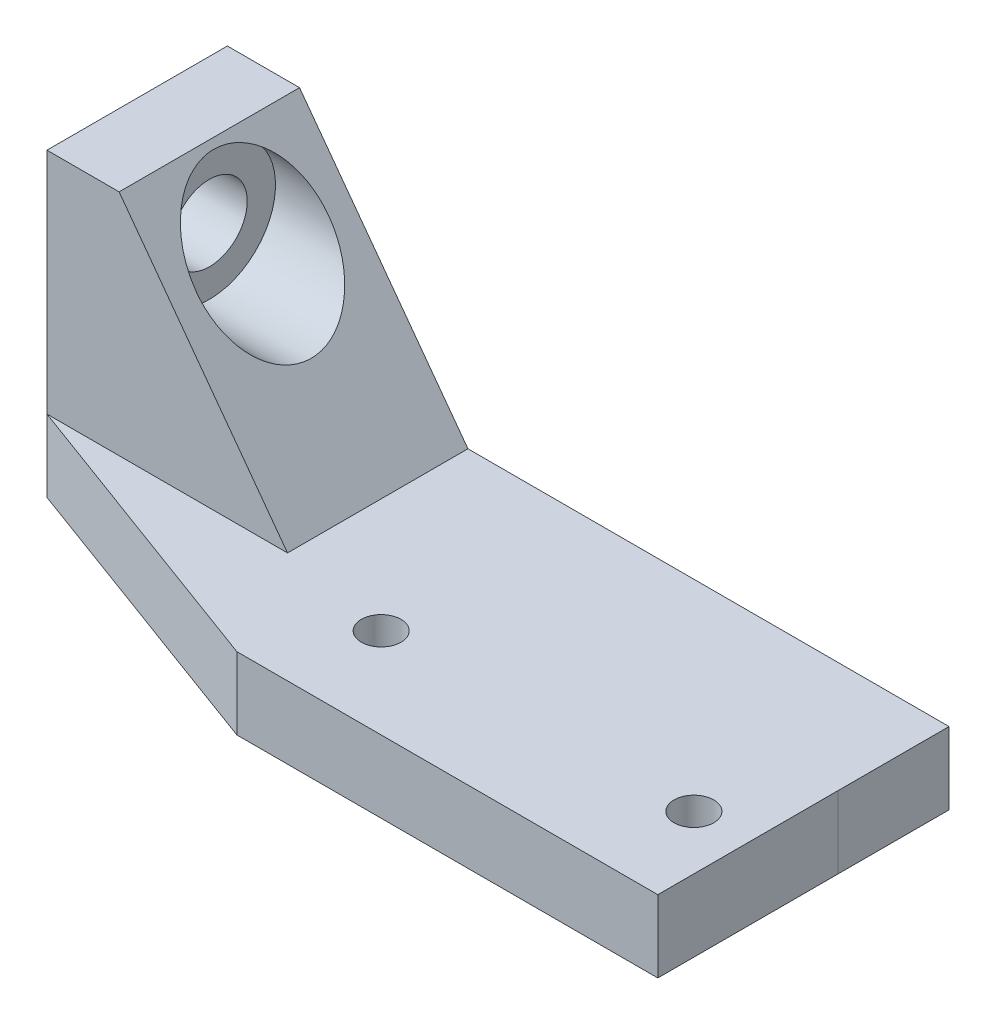
ISO-10303-21;
HEADER;
FILE_DESCRIPTION(('STEP AP214'),'2;1');
FILE_NAME('part.step','',(''),(''),'','','');
FILE_SCHEMA(('AUTOMOTIVE_DESIGN { 1 0 10303 214 1 1 1 1 }'));
ENDSEC;
DATA;
#1=APPLICATION_CONTEXT('core data for automotive mechanical design processes');
#2=APPLICATION_PROTOCOL_DEFINITION('international standard','automotive_design',2000,#1);
#3=PRODUCT_CONTEXT('',#1,'mechanical');
#4=PRODUCT('Part','Part','',(#3));
#5=PRODUCT_RELATED_PRODUCT_CATEGORY('part','',(#4));
#6=PRODUCT_DEFINITION_FORMATION('','',#4);
#7=PRODUCT_DEFINITION_CONTEXT('part definition',#1,'design');
#8=PRODUCT_DEFINITION('design','',#6,#7);
#9=PRODUCT_DEFINITION_SHAPE('','',#8);
#10=(LENGTH_UNIT() NAMED_UNIT(*) SI_UNIT(.MILLI.,.METRE.));
#11=(NAMED_UNIT(*) PLANE_ANGLE_UNIT() SI_UNIT($,.RADIAN.));
#12=(NAMED_UNIT(*) SI_UNIT($,.STERADIAN.) SOLID_ANGLE_UNIT());
#13=UNCERTAINTY_MEASURE_WITH_UNIT(LENGTH_MEASURE(1.E-05),#10,'distance_accuracy_value','');
#14=(GEOMETRIC_REPRESENTATION_CONTEXT(3) GLOBAL_UNCERTAINTY_ASSIGNED_CONTEXT((#13)) GLOBAL_UNIT_ASSIGNED_CONTEXT((#10,
#11,#12)) REPRESENTATION_CONTEXT('',''));
#15=CARTESIAN_POINT('',(0.,0.,0.));
#16=DIRECTION('',(0.,0.,1.));
#17=DIRECTION('',(1.,0.,0.));
#18=AXIS2_PLACEMENT_3D('',#15,#16,#17);
#19=CARTESIAN_POINT('',(0.,6.,0.));
#20=DIRECTION('',(0.,1.,0.));
#21=DIRECTION('',(0.,0.,1.));
#22=AXIS2_PLACEMENT_3D('',#19,#20,#21);
#23=PLANE('',#22);
#24=CARTESIAN_POINT('',(13.,6.,0.));
#25=DIRECTION('',(0.,1.,0.));
#26=DIRECTION('',(0.,0.,1.));
#27=AXIS2_PLACEMENT_3D('',#24,#25,#26);
#28=CIRCLE('',#27,1.65);
#29=CARTESIAN_POINT('',(13.,6.,1.65));
#30=VERTEX_POINT('',#29);
#31=EDGE_CURVE('E159',#30,#30,#28,.T.);
#32=ORIENTED_EDGE('',*,*,#31,.F.);
#33=EDGE_LOOP('',(#32));
#34=FACE_BOUND('',#33,.T.);
#35=CARTESIAN_POINT('',(-13.,6.,0.));
#36=DIRECTION('',(0.,1.,0.));
#37=DIRECTION('',(0.,0.,1.));
#38=AXIS2_PLACEMENT_3D('',#35,#36,#37);
#39=CIRCLE('',#38,1.65);
#40=CARTESIAN_POINT('',(-13.,6.,1.65));
#41=VERTEX_POINT('',#40);
#42=EDGE_CURVE('E162',#41,#41,#39,.T.);
#43=ORIENTED_EDGE('',*,*,#42,.F.);
#44=EDGE_LOOP('',(#43));
#45=FACE_BOUND('',#44,.T.);
#46=DIRECTION('',(0.,0.,1.));
#47=VECTOR('',#46,1.);
#48=CARTESIAN_POINT('',(-22.498631959725,6.,0.));
#49=LINE('',#48,#47);
#50=CARTESIAN_POINT('',(-22.498631959725,6.,-16.7116618904396));
#51=VERTEX_POINT('',#50);
#52=CARTESIAN_POINT('',(-22.498631959725,6.,-1.71166189043959));
#53=VERTEX_POINT('',#52);
#54=EDGE_CURVE('E120',#51,#53,#49,.T.);
#55=ORIENTED_EDGE('',*,*,#54,.T.);
#56=DIRECTION('',(-1.,0.,0.));
#57=VECTOR('',#56,1.);
#58=CARTESIAN_POINT('',(0.,6.,-1.71166189043959));
#59=LINE('',#58,#57);
#60=CARTESIAN_POINT('',(-42.498631959725,6.,-1.71166189043959));
#61=VERTEX_POINT('',#60);
#62=EDGE_CURVE('E144',#53,#61,#59,.T.);
#63=ORIENTED_EDGE('',*,*,#62,.T.);
#64=DIRECTION('',(0.938323151641533,0.,0.34575954519507));
#65=VECTOR('',#64,1.);
#66=CARTESIAN_POINT('',(-4.52537550031813,6.,12.2809757845564));
#67=LINE('',#66,#65);
#68=CARTESIAN_POINT('',(-17.5,6.,7.5));
#69=VERTEX_POINT('',#68);
#70=EDGE_CURVE('E148',#61,#69,#67,.T.);
#71=ORIENTED_EDGE('',*,*,#70,.T.);
#72=DIRECTION('',(1.,0.,0.));
#73=VECTOR('',#72,1.);
#74=CARTESIAN_POINT('',(0.,6.,7.5));
#75=LINE('',#74,#73);
#76=CARTESIAN_POINT('',(17.5,6.,7.5));
#77=VERTEX_POINT('',#76);
#78=EDGE_CURVE('E99',#69,#77,#75,.T.);
#79=ORIENTED_EDGE('',*,*,#78,.T.);
#80=DIRECTION('',(0.,0.,1.));
#81=VECTOR('',#80,1.);
#82=CARTESIAN_POINT('',(17.5,6.,0.));
#83=LINE('',#82,#81);
#84=CARTESIAN_POINT('',(17.5,6.,-7.5));
#85=VERTEX_POINT('',#84);
#86=EDGE_CURVE('E152',#85,#77,#83,.T.);
#87=ORIENTED_EDGE('',*,*,#86,.F.);
#88=DIRECTION('',(-0.000148511775343655,0.,0.999999988972126));
#89=VECTOR('',#88,1.);
#90=CARTESIAN_POINT('',(17.4988857757216,6.,0.00259879062174738));
#91=LINE('',#90,#89);
#92=CARTESIAN_POINT('',(17.5013680402763,6.,-16.7116618904396));
#93=VERTEX_POINT('',#92);
#94=EDGE_CURVE('E155',#93,#85,#91,.T.);
#95=ORIENTED_EDGE('',*,*,#94,.F.);
#96=DIRECTION('',(1.,0.,0.));
#97=VECTOR('',#96,1.);
#98=CARTESIAN_POINT('',(0.,6.,-16.7116618904396));
#99=LINE('',#98,#97);
#100=EDGE_CURVE('E64',#51,#93,#99,.T.);
#101=ORIENTED_EDGE('',*,*,#100,.F.);
#102=EDGE_LOOP('',(#55,#63,#71,#79,#87,#95,#101));
#103=FACE_BOUND('',#102,.T.);
#104=ADVANCED_FACE('F38',(#34,#45,#103),#23,.T.);
#105=CARTESIAN_POINT('',(-4.52537550031813,6.,12.2809757845564));
#106=DIRECTION('',(0.34575954519507,0.,-0.938323151641532));
#107=DIRECTION('',(-0.938323151641532,0.,-0.34575954519507));
#108=AXIS2_PLACEMENT_3D('',#105,#106,#107);
#109=PLANE('',#108);
#110=DIRECTION('',(0.938323151641533,0.,0.34575954519507));
#111=VECTOR('',#110,1.);
#112=CARTESIAN_POINT('',(-4.52537550031813,0.,12.2809757845564));
#113=LINE('',#112,#111);
#114=CARTESIAN_POINT('',(-42.498631959725,0.,-1.71166189043959));
#115=VERTEX_POINT('',#114);
#116=CARTESIAN_POINT('',(-17.5,0.,7.5));
#117=VERTEX_POINT('',#116);
#118=EDGE_CURVE('E147',#115,#117,#113,.T.);
#119=ORIENTED_EDGE('',*,*,#118,.T.);
#120=DIRECTION('',(0.,-1.,0.));
#121=VECTOR('',#120,1.);
#122=CARTESIAN_POINT('',(-17.5,6.,7.5));
#123=LINE('',#122,#121);
#124=EDGE_CURVE('E11',#69,#117,#123,.T.);
#125=ORIENTED_EDGE('',*,*,#124,.F.);
#126=ORIENTED_EDGE('',*,*,#70,.F.);
#127=DIRECTION('',(0.,-1.,0.));
#128=VECTOR('',#127,1.);
#129=CARTESIAN_POINT('',(-42.498631959725,6.,-1.71166189043959));
#130=LINE('',#129,#128);
#131=EDGE_CURVE('E165',#61,#115,#130,.T.);
#132=ORIENTED_EDGE('',*,*,#131,.T.);
#133=EDGE_LOOP('',(#119,#125,#126,#132));
#134=FACE_BOUND('',#133,.T.);
#135=ADVANCED_FACE('F40',(#134),#109,.F.);
#136=CARTESIAN_POINT('',(0.,6.,7.5));
#137=DIRECTION('',(0.,0.,-1.));
#138=DIRECTION('',(-1.,0.,0.));
#139=AXIS2_PLACEMENT_3D('',#136,#137,#138);
#140=PLANE('',#139);
#141=DIRECTION('',(1.,0.,0.));
#142=VECTOR('',#141,1.);
#143=CARTESIAN_POINT('',(0.,0.,7.5));
#144=LINE('',#143,#142);
#145=CARTESIAN_POINT('',(17.5,0.,7.5));
#146=VERTEX_POINT('',#145);
#147=EDGE_CURVE('E168',#117,#146,#144,.T.);
#148=ORIENTED_EDGE('',*,*,#147,.T.);
#149=DIRECTION('',(0.,-1.,0.));
#150=VECTOR('',#149,1.);
#151=CARTESIAN_POINT('',(17.5,6.,7.5));
#152=LINE('',#151,#150);
#153=EDGE_CURVE('E47',#77,#146,#152,.T.);
#154=ORIENTED_EDGE('',*,*,#153,.F.);
#155=ORIENTED_EDGE('',*,*,#78,.F.);
#156=ORIENTED_EDGE('',*,*,#124,.T.);
#157=EDGE_LOOP('',(#148,#154,#155,#156));
#158=FACE_BOUND('',#157,.T.);
#159=ADVANCED_FACE('F224',(#158),#140,.F.);
#160=CARTESIAN_POINT('',(17.5,6.,0.));
#161=DIRECTION('',(1.,0.,0.));
#162=DIRECTION('',(0.,0.,-1.));
#163=AXIS2_PLACEMENT_3D('',#160,#161,#162);
#164=PLANE('',#163);
#165=DIRECTION('',(0.,0.,1.));
#166=VECTOR('',#165,1.);
#167=CARTESIAN_POINT('',(17.5,0.,0.));
#168=LINE('',#167,#166);
#169=CARTESIAN_POINT('',(17.5,0.,-7.5));
#170=VERTEX_POINT('',#169);
#171=EDGE_CURVE('E171',#170,#146,#168,.T.);
#172=ORIENTED_EDGE('',*,*,#171,.F.);
#173=DIRECTION('',(0.,-1.,0.));
#174=VECTOR('',#173,1.);
#175=CARTESIAN_POINT('',(17.5,6.,-7.5));
#176=LINE('',#175,#174);
#177=EDGE_CURVE('E189',#85,#170,#176,.T.);
#178=ORIENTED_EDGE('',*,*,#177,.F.);
#179=ORIENTED_EDGE('',*,*,#86,.T.);
#180=ORIENTED_EDGE('',*,*,#153,.T.);
#181=EDGE_LOOP('',(#172,#178,#179,#180));
#182=FACE_BOUND('',#181,.T.);
#183=ADVANCED_FACE('F226',(#182),#164,.T.);
#184=CARTESIAN_POINT('',(17.4988857757216,6.,0.00259879062174738));
#185=DIRECTION('',(0.999999988972126,0.,0.000148511775343655));
#186=DIRECTION('',(0.000148511775343655,0.,-0.999999988972126));
#187=AXIS2_PLACEMENT_3D('',#184,#185,#186);
#188=PLANE('',#187);
#189=DIRECTION('',(-0.000148511775343655,0.,0.999999988972126));
#190=VECTOR('',#189,1.);
#191=CARTESIAN_POINT('',(17.4988857757216,0.,0.00259879062174738));
#192=LINE('',#191,#190);
#193=CARTESIAN_POINT('',(17.5013680402763,0.,-16.7116618904396));
#194=VERTEX_POINT('',#193);
#195=EDGE_CURVE('E174',#194,#170,#192,.T.);
#196=ORIENTED_EDGE('',*,*,#195,.F.);
#197=DIRECTION('',(0.,-1.,0.));
#198=VECTOR('',#197,1.);
#199=CARTESIAN_POINT('',(17.5013680402763,6.,-16.7116618904396));
#200=LINE('',#199,#198);
#201=EDGE_CURVE('E187',#93,#194,#200,.T.);
#202=ORIENTED_EDGE('',*,*,#201,.F.);
#203=ORIENTED_EDGE('',*,*,#94,.T.);
#204=ORIENTED_EDGE('',*,*,#177,.T.);
#205=EDGE_LOOP('',(#196,#202,#203,#204));
#206=FACE_BOUND('',#205,.T.);
#207=ADVANCED_FACE('F217',(#206),#188,.T.);
#208=CARTESIAN_POINT('',(0.,6.,-16.7116618904396));
#209=DIRECTION('',(0.,0.,-1.));
#210=DIRECTION('',(-1.,0.,0.));
#211=AXIS2_PLACEMENT_3D('',#208,#209,#210);
#212=PLANE('',#211);
#213=DIRECTION('',(0.59319903804985,-0.805055837353368,0.));
#214=VECTOR('',#213,1.);
#215=CARTESIAN_POINT('',(-36.498631959725,25.,-16.7116618904396));
#216=LINE('',#215,#214);
#217=CARTESIAN_POINT('',(-36.498631959725,25.,-16.7116618904396));
#218=VERTEX_POINT('',#217);
#219=EDGE_CURVE('E116',#218,#51,#216,.T.);
#220=ORIENTED_EDGE('',*,*,#219,.T.);
#221=ORIENTED_EDGE('',*,*,#100,.T.);
#222=ORIENTED_EDGE('',*,*,#201,.T.);
#223=DIRECTION('',(1.,0.,0.));
#224=VECTOR('',#223,1.);
#225=CARTESIAN_POINT('',(0.,0.,-16.7116618904396));
#226=LINE('',#225,#224);
#227=CARTESIAN_POINT('',(-42.498631959725,0.,-16.7116618904396));
#228=VERTEX_POINT('',#227);
#229=EDGE_CURVE('E177',#228,#194,#226,.T.);
#230=ORIENTED_EDGE('',*,*,#229,.F.);
#231=DIRECTION('',(0.,-1.,0.));
#232=VECTOR('',#231,1.);
#233=CARTESIAN_POINT('',(-42.498631959725,6.,-16.7116618904396));
#234=LINE('',#233,#232);
#235=CARTESIAN_POINT('',(-42.498631959725,25.,-16.7116618904396));
#236=VERTEX_POINT('',#235);
#237=EDGE_CURVE('E134',#236,#228,#234,.T.);
#238=ORIENTED_EDGE('',*,*,#237,.F.);
#239=DIRECTION('',(-1.,0.,0.));
#240=VECTOR('',#239,1.);
#241=CARTESIAN_POINT('',(-22.498631959725,25.,-16.7116618904396));
#242=LINE('',#241,#240);
#243=EDGE_CURVE('E127',#218,#236,#242,.T.);
#244=ORIENTED_EDGE('',*,*,#243,.F.);
#245=EDGE_LOOP('',(#220,#221,#222,#230,#238,#244));
#246=FACE_BOUND('',#245,.T.);
#247=ADVANCED_FACE('F132',(#246),#212,.T.);
#248=CARTESIAN_POINT('',(13.,6.,0.));
#249=DIRECTION('',(0.,-1.,0.));
#250=DIRECTION('',(0.,0.,-1.));
#251=AXIS2_PLACEMENT_3D('',#248,#249,#250);
#252=CYLINDRICAL_SURFACE('',#251,1.65);
#253=ORIENTED_EDGE('',*,*,#31,.T.);
#254=EDGE_LOOP('',(#253));
#255=FACE_BOUND('',#254,.T.);
#256=CARTESIAN_POINT('',(13.,0.,0.));
#257=DIRECTION('',(0.,1.,0.));
#258=DIRECTION('',(0.,0.,1.));
#259=AXIS2_PLACEMENT_3D('',#256,#257,#258);
#260=CIRCLE('',#259,1.65);
#261=CARTESIAN_POINT('',(13.,0.,1.65));
#262=VERTEX_POINT('',#261);
#263=EDGE_CURVE('E180',#262,#262,#260,.T.);
#264=ORIENTED_EDGE('',*,*,#263,.F.);
#265=EDGE_LOOP('',(#264));
#266=FACE_BOUND('',#265,.T.);
#267=ADVANCED_FACE('F252',(#255,#266),#252,.F.);
#268=CARTESIAN_POINT('',(-42.498631959725,6.,0.));
#269=DIRECTION('',(1.,0.,0.));
#270=DIRECTION('',(0.,0.,-1.));
#271=AXIS2_PLACEMENT_3D('',#268,#269,#270);
#272=PLANE('',#271);
#273=DIRECTION('',(0.,0.,1.));
#274=VECTOR('',#273,1.);
#275=CARTESIAN_POINT('',(-42.498631959725,0.,0.));
#276=LINE('',#275,#274);
#277=EDGE_CURVE('E92',#228,#115,#276,.T.);
#278=ORIENTED_EDGE('',*,*,#277,.T.);
#279=ORIENTED_EDGE('',*,*,#131,.F.);
#280=DIRECTION('',(0.,-1.,0.));
#281=VECTOR('',#280,1.);
#282=CARTESIAN_POINT('',(-42.498631959725,0.,-1.71166189043959));
#283=LINE('',#282,#281);
#284=CARTESIAN_POINT('',(-42.498631959725,25.,-1.71166189043959));
#285=VERTEX_POINT('',#284);
#286=EDGE_CURVE('E136',#285,#61,#283,.T.);
#287=ORIENTED_EDGE('',*,*,#286,.F.);
#288=DIRECTION('',(0.,0.,1.));
#289=VECTOR('',#288,1.);
#290=CARTESIAN_POINT('',(-42.498631959725,25.,0.));
#291=LINE('',#290,#289);
#292=EDGE_CURVE('E140',#236,#285,#291,.T.);
#293=ORIENTED_EDGE('',*,*,#292,.F.);
#294=ORIENTED_EDGE('',*,*,#237,.T.);
#295=EDGE_LOOP('',(#278,#279,#287,#293,#294));
#296=FACE_BOUND('',#295,.T.);
#297=CARTESIAN_POINT('',(-42.498631959725,19.,-9.21166189043959));
#298=DIRECTION('',(-1.,0.,0.));
#299=DIRECTION('',(0.,0.,1.));
#300=AXIS2_PLACEMENT_3D('',#297,#298,#299);
#301=CIRCLE('',#300,3.15);
#302=CARTESIAN_POINT('',(-42.498631959725,19.,-6.06166189043959));
#303=VERTEX_POINT('',#302);
#304=EDGE_CURVE('E130',#303,#303,#301,.T.);
#305=ORIENTED_EDGE('',*,*,#304,.F.);
#306=EDGE_LOOP('',(#305));
#307=FACE_BOUND('',#306,.T.);
#308=ADVANCED_FACE('F206',(#296,#307),#272,.F.);
#309=CARTESIAN_POINT('',(-13.,6.,0.));
#310=DIRECTION('',(0.,-1.,0.));
#311=DIRECTION('',(0.,0.,-1.));
#312=AXIS2_PLACEMENT_3D('',#309,#310,#311);
#313=CYLINDRICAL_SURFACE('',#312,1.65);
#314=ORIENTED_EDGE('',*,*,#42,.T.);
#315=EDGE_LOOP('',(#314));
#316=FACE_BOUND('',#315,.T.);
#317=CARTESIAN_POINT('',(-13.,0.,0.));
#318=DIRECTION('',(0.,1.,0.));
#319=DIRECTION('',(0.,0.,1.));
#320=AXIS2_PLACEMENT_3D('',#317,#318,#319);
#321=CIRCLE('',#320,1.65);
#322=CARTESIAN_POINT('',(-13.,0.,1.65));
#323=VERTEX_POINT('',#322);
#324=EDGE_CURVE('E150',#323,#323,#321,.T.);
#325=ORIENTED_EDGE('',*,*,#324,.F.);
#326=EDGE_LOOP('',(#325));
#327=FACE_BOUND('',#326,.T.);
#328=ADVANCED_FACE('F248',(#316,#327),#313,.F.);
#329=CARTESIAN_POINT('',(0.,0.,0.));
#330=DIRECTION('',(0.,1.,0.));
#331=DIRECTION('',(0.,0.,1.));
#332=AXIS2_PLACEMENT_3D('',#329,#330,#331);
#333=PLANE('',#332);
#334=ORIENTED_EDGE('',*,*,#118,.F.);
#335=ORIENTED_EDGE('',*,*,#277,.F.);
#336=ORIENTED_EDGE('',*,*,#229,.T.);
#337=ORIENTED_EDGE('',*,*,#195,.T.);
#338=ORIENTED_EDGE('',*,*,#171,.T.);
#339=ORIENTED_EDGE('',*,*,#147,.F.);
#340=EDGE_LOOP('',(#334,#335,#336,#337,#338,#339));
#341=FACE_BOUND('',#340,.T.);
#342=ORIENTED_EDGE('',*,*,#324,.T.);
#343=EDGE_LOOP('',(#342));
#344=FACE_BOUND('',#343,.T.);
#345=ORIENTED_EDGE('',*,*,#263,.T.);
#346=EDGE_LOOP('',(#345));
#347=FACE_BOUND('',#346,.T.);
#348=ADVANCED_FACE('F221',(#341,#344,#347),#333,.F.);
#349=CARTESIAN_POINT('',(-22.498631959725,25.,0.));
#350=DIRECTION('',(0.,-1.,0.));
#351=DIRECTION('',(0.,0.,-1.));
#352=AXIS2_PLACEMENT_3D('',#349,#350,#351);
#353=PLANE('',#352);
#354=DIRECTION('',(-1.,0.,0.));
#355=VECTOR('',#354,1.);
#356=CARTESIAN_POINT('',(-22.498631959725,25.,-1.71166189043959));
#357=LINE('',#356,#355);
#358=CARTESIAN_POINT('',(-36.498631959725,25.,-1.71166189043959));
#359=VERTEX_POINT('',#358);
#360=EDGE_CURVE('E129',#359,#285,#357,.T.);
#361=ORIENTED_EDGE('',*,*,#360,.F.);
#362=DIRECTION('',(0.,0.,1.));
#363=VECTOR('',#362,1.);
#364=CARTESIAN_POINT('',(-36.498631959725,25.,-16.7116618904396));
#365=LINE('',#364,#363);
#366=EDGE_CURVE('E119',#218,#359,#365,.T.);
#367=ORIENTED_EDGE('',*,*,#366,.F.);
#368=ORIENTED_EDGE('',*,*,#243,.T.);
#369=ORIENTED_EDGE('',*,*,#292,.T.);
#370=EDGE_LOOP('',(#361,#367,#368,#369));
#371=FACE_BOUND('',#370,.T.);
#372=ADVANCED_FACE('F125',(#371),#353,.F.);
#373=CARTESIAN_POINT('',(-22.498631959725,0.,-1.71166189043959));
#374=DIRECTION('',(0.,0.,-1.));
#375=DIRECTION('',(-1.,0.,0.));
#376=AXIS2_PLACEMENT_3D('',#373,#374,#375);
#377=PLANE('',#376);
#378=ORIENTED_EDGE('',*,*,#62,.F.);
#379=DIRECTION('',(0.59319903804985,-0.805055837353368,0.));
#380=VECTOR('',#379,1.);
#381=CARTESIAN_POINT('',(-36.498631959725,25.,-1.71166189043959));
#382=LINE('',#381,#380);
#383=EDGE_CURVE('E55',#359,#53,#382,.T.);
#384=ORIENTED_EDGE('',*,*,#383,.F.);
#385=ORIENTED_EDGE('',*,*,#360,.T.);
#386=ORIENTED_EDGE('',*,*,#286,.T.);
#387=EDGE_LOOP('',(#378,#384,#385,#386));
#388=FACE_BOUND('',#387,.T.);
#389=ADVANCED_FACE('F210',(#388),#377,.F.);
#390=CARTESIAN_POINT('',(-22.498631959725,19.,-9.21166189043959));
#391=DIRECTION('',(-1.,0.,0.));
#392=DIRECTION('',(0.,0.,1.));
#393=AXIS2_PLACEMENT_3D('',#390,#391,#392);
#394=CYLINDRICAL_SURFACE('',#393,3.15);
#395=CARTESIAN_POINT('',(-36.498631959725,19.,-9.21166189043959));
#396=DIRECTION('',(-1.,0.,0.));
#397=DIRECTION('',(0.,0.,1.));
#398=AXIS2_PLACEMENT_3D('',#395,#396,#397);
#399=CIRCLE('',#398,3.15);
#400=CARTESIAN_POINT('',(-36.498631959725,19.,-6.06166189043959));
#401=VERTEX_POINT('',#400);
#402=EDGE_CURVE('E42',#401,#401,#399,.F.);
#403=ORIENTED_EDGE('',*,*,#402,.T.);
#404=EDGE_LOOP('',(#403));
#405=FACE_BOUND('',#404,.T.);
#406=ORIENTED_EDGE('',*,*,#304,.T.);
#407=EDGE_LOOP('',(#406));
#408=FACE_BOUND('',#407,.T.);
#409=ADVANCED_FACE('F244',(#405,#408),#394,.F.);
#410=CARTESIAN_POINT('',(-36.498631959725,25.,-16.7116618904396));
#411=DIRECTION('',(-0.805055837353368,-0.59319903804985,0.));
#412=DIRECTION('',(0.59319903804985,-0.805055837353368,0.));
#413=AXIS2_PLACEMENT_3D('',#410,#411,#412);
#414=PLANE('',#413);
#415=CARTESIAN_POINT('',(-32.0775793281461,19.,-9.21166189043959));
#416=DIRECTION('',(-0.805055837353368,-0.59319903804985,0.));
#417=DIRECTION('',(-0.59319903804985,0.805055837353368,0.));
#418=AXIS2_PLACEMENT_3D('',#415,#416,#417);
#419=ELLIPSE('',#418,6.83182425964554,5.5);
#420=CARTESIAN_POINT('',(-36.1302109070934,24.5,-9.21166189043959));
#421=VERTEX_POINT('',#420);
#422=EDGE_CURVE('E191',#421,#421,#419,.T.);
#423=ORIENTED_EDGE('',*,*,#422,.T.);
#424=EDGE_LOOP('',(#423));
#425=FACE_BOUND('',#424,.T.);
#426=ORIENTED_EDGE('',*,*,#383,.T.);
#427=ORIENTED_EDGE('',*,*,#54,.F.);
#428=ORIENTED_EDGE('',*,*,#219,.F.);
#429=ORIENTED_EDGE('',*,*,#366,.T.);
#430=EDGE_LOOP('',(#426,#427,#428,#429));
#431=FACE_BOUND('',#430,.T.);
#432=ADVANCED_FACE('F118',(#425,#431),#414,.F.);
#433=CARTESIAN_POINT('',(-36.498631959725,19.,-9.21166189043959));
#434=DIRECTION('',(-1.,0.,0.));
#435=DIRECTION('',(0.,0.,1.));
#436=AXIS2_PLACEMENT_3D('',#433,#434,#435);
#437=PLANE('',#436);
#438=CARTESIAN_POINT('',(-36.498631959725,19.,-9.21166189043959));
#439=DIRECTION('',(-1.,0.,0.));
#440=DIRECTION('',(0.,0.,1.));
#441=AXIS2_PLACEMENT_3D('',#438,#439,#440);
#442=CIRCLE('',#441,5.5);
#443=CARTESIAN_POINT('',(-36.498631959725,19.,-3.71166189043959));
#444=VERTEX_POINT('',#443);
#445=EDGE_CURVE('E193',#444,#444,#442,.T.);
#446=ORIENTED_EDGE('',*,*,#445,.F.);
#447=EDGE_LOOP('',(#446));
#448=FACE_BOUND('',#447,.T.);
#449=ORIENTED_EDGE('',*,*,#402,.F.);
#450=EDGE_LOOP('',(#449));
#451=FACE_BOUND('',#450,.T.);
#452=ADVANCED_FACE('F302',(#448,#451),#437,.F.);
#453=CARTESIAN_POINT('',(17.5013680402763,19.,-9.21166189043959));
#454=DIRECTION('',(-1.,0.,0.));
#455=DIRECTION('',(0.,0.,1.));
#456=AXIS2_PLACEMENT_3D('',#453,#454,#455);
#457=CYLINDRICAL_SURFACE('',#456,5.5);
#458=ORIENTED_EDGE('',*,*,#445,.T.);
#459=EDGE_LOOP('',(#458));
#460=FACE_BOUND('',#459,.T.);
#461=ORIENTED_EDGE('',*,*,#422,.F.);
#462=EDGE_LOOP('',(#461));
#463=FACE_BOUND('',#462,.T.);
#464=ADVANCED_FACE('F309',(#460,#463),#457,.F.);
#465=CLOSED_SHELL('',(#104,#135,#159,#183,#207,#247,#267,#308,#328,#348,#372,#389,#409,#432,
#452,#464));
#466=MANIFOLD_SOLID_BREP('B2',#465);
#467=ADVANCED_BREP_SHAPE_REPRESENTATION('',(#18,#466),#14);
#468=SHAPE_DEFINITION_REPRESENTATION(#9,#467);
ENDSEC;
END-ISO-10303-21;
